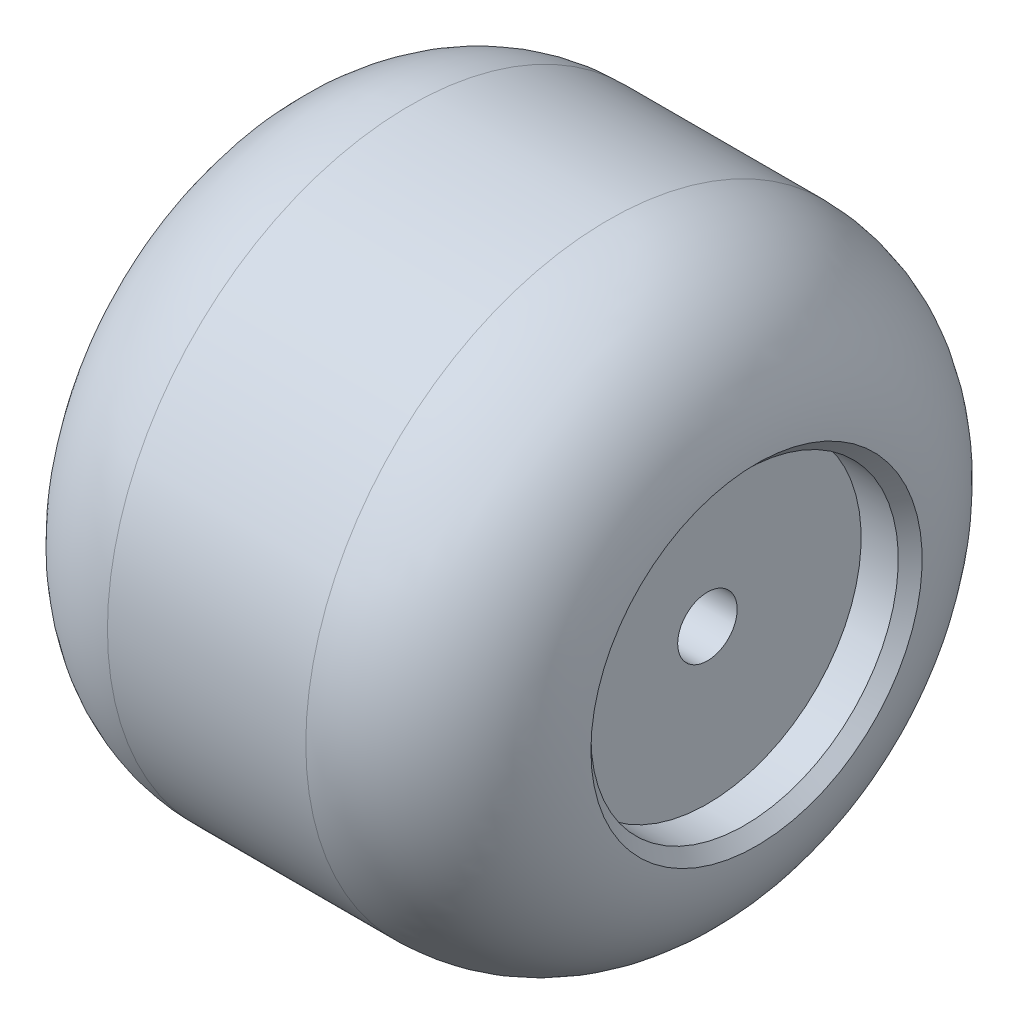
ISO-10303-21;
HEADER;
FILE_DESCRIPTION(('STEP AP214'),'2;1');
FILE_NAME('part.step','',(''),(''),'','','');
FILE_SCHEMA(('AUTOMOTIVE_DESIGN { 1 0 10303 214 1 1 1 1 }'));
ENDSEC;
DATA;
#1=APPLICATION_CONTEXT('core data for automotive mechanical design processes');
#2=APPLICATION_PROTOCOL_DEFINITION('international standard','automotive_design',2000,#1);
#3=PRODUCT_CONTEXT('',#1,'mechanical');
#4=PRODUCT('Part','Part','',(#3));
#5=PRODUCT_RELATED_PRODUCT_CATEGORY('part','',(#4));
#6=PRODUCT_DEFINITION_FORMATION('','',#4);
#7=PRODUCT_DEFINITION_CONTEXT('part definition',#1,'design');
#8=PRODUCT_DEFINITION('design','',#6,#7);
#9=PRODUCT_DEFINITION_SHAPE('','',#8);
#10=(LENGTH_UNIT() NAMED_UNIT(*) SI_UNIT(.MILLI.,.METRE.));
#11=(NAMED_UNIT(*) PLANE_ANGLE_UNIT() SI_UNIT($,.RADIAN.));
#12=(NAMED_UNIT(*) SI_UNIT($,.STERADIAN.) SOLID_ANGLE_UNIT());
#13=UNCERTAINTY_MEASURE_WITH_UNIT(LENGTH_MEASURE(1.E-05),#10,'distance_accuracy_value','');
#14=(GEOMETRIC_REPRESENTATION_CONTEXT(3) GLOBAL_UNCERTAINTY_ASSIGNED_CONTEXT((#13)) GLOBAL_UNIT_ASSIGNED_CONTEXT((#10,
#11,#12)) REPRESENTATION_CONTEXT('',''));
#15=CARTESIAN_POINT('',(0.,0.,0.));
#16=DIRECTION('',(0.,0.,1.));
#17=DIRECTION('',(1.,0.,0.));
#18=AXIS2_PLACEMENT_3D('',#15,#16,#17);
#19=CARTESIAN_POINT('',(6.,0.,0.));
#20=DIRECTION('',(-1.,0.,0.));
#21=DIRECTION('',(0.,0.,1.));
#22=AXIS2_PLACEMENT_3D('',#19,#20,#21);
#23=TOROIDAL_SURFACE('',#22,6.2,6.);
#24=CARTESIAN_POINT('',(6.,0.,0.));
#25=DIRECTION('',(-1.,0.,0.));
#26=DIRECTION('',(0.,0.,1.));
#27=AXIS2_PLACEMENT_3D('',#24,#25,#26);
#28=CIRCLE('',#27,12.2);
#29=CARTESIAN_POINT('',(6.,0.,12.2));
#30=VERTEX_POINT('',#29);
#31=EDGE_CURVE('E80',#30,#30,#28,.T.);
#32=ORIENTED_EDGE('',*,*,#31,.T.);
#33=EDGE_LOOP('',(#32));
#34=FACE_BOUND('',#33,.T.);
#35=CARTESIAN_POINT('',(0.,0.,0.));
#36=DIRECTION('',(-1.,0.,0.));
#37=DIRECTION('',(0.,0.,1.));
#38=AXIS2_PLACEMENT_3D('',#35,#36,#37);
#39=CIRCLE('',#38,6.2);
#40=CARTESIAN_POINT('',(0.,0.,6.2));
#41=VERTEX_POINT('',#40);
#42=EDGE_CURVE('E10',#41,#41,#39,.T.);
#43=ORIENTED_EDGE('',*,*,#42,.F.);
#44=EDGE_LOOP('',(#43));
#45=FACE_BOUND('',#44,.T.);
#46=ADVANCED_FACE('F45',(#34,#45),#23,.T.);
#47=CARTESIAN_POINT('',(0.,0.,0.));
#48=DIRECTION('',(-1.,0.,0.));
#49=DIRECTION('',(0.,0.,1.));
#50=AXIS2_PLACEMENT_3D('',#47,#48,#49);
#51=PLANE('',#50);
#52=ORIENTED_EDGE('',*,*,#42,.T.);
#53=EDGE_LOOP('',(#52));
#54=FACE_BOUND('',#53,.T.);
#55=CARTESIAN_POINT('',(0.,0.,0.));
#56=DIRECTION('',(-1.,0.,0.));
#57=DIRECTION('',(0.,0.,1.));
#58=AXIS2_PLACEMENT_3D('',#55,#56,#57);
#59=CIRCLE('',#58,1.2);
#60=CARTESIAN_POINT('',(0.,0.,1.2));
#61=VERTEX_POINT('',#60);
#62=EDGE_CURVE('E52',#61,#61,#59,.T.);
#63=ORIENTED_EDGE('',*,*,#62,.F.);
#64=EDGE_LOOP('',(#63));
#65=FACE_BOUND('',#64,.T.);
#66=ADVANCED_FACE('F99',(#54,#65),#51,.T.);
#67=CARTESIAN_POINT('',(0.,0.,0.));
#68=DIRECTION('',(-1.,0.,0.));
#69=DIRECTION('',(0.,0.,1.));
#70=AXIS2_PLACEMENT_3D('',#67,#68,#69);
#71=CYLINDRICAL_SURFACE('',#70,1.2);
#72=CARTESIAN_POINT('',(18.,0.,0.));
#73=DIRECTION('',(-1.,0.,0.));
#74=DIRECTION('',(0.,0.,1.));
#75=AXIS2_PLACEMENT_3D('',#72,#73,#74);
#76=CIRCLE('',#75,1.2);
#77=CARTESIAN_POINT('',(18.,0.,1.2));
#78=VERTEX_POINT('',#77);
#79=EDGE_CURVE('E57',#78,#78,#76,.T.);
#80=ORIENTED_EDGE('',*,*,#79,.F.);
#81=EDGE_LOOP('',(#80));
#82=FACE_BOUND('',#81,.T.);
#83=ORIENTED_EDGE('',*,*,#62,.T.);
#84=EDGE_LOOP('',(#83));
#85=FACE_BOUND('',#84,.T.);
#86=ADVANCED_FACE('F103',(#82,#85),#71,.F.);
#87=CARTESIAN_POINT('',(18.,0.,0.));
#88=DIRECTION('',(1.,0.,0.));
#89=DIRECTION('',(0.,0.,-1.));
#90=AXIS2_PLACEMENT_3D('',#87,#88,#89);
#91=PLANE('',#90);
#92=ORIENTED_EDGE('',*,*,#79,.T.);
#93=EDGE_LOOP('',(#92));
#94=FACE_BOUND('',#93,.T.);
#95=CARTESIAN_POINT('',(18.,0.,0.));
#96=DIRECTION('',(-1.,0.,0.));
#97=DIRECTION('',(0.,0.,1.));
#98=AXIS2_PLACEMENT_3D('',#95,#96,#97);
#99=CIRCLE('',#98,6.2);
#100=CARTESIAN_POINT('',(18.,0.,6.2));
#101=VERTEX_POINT('',#100);
#102=EDGE_CURVE('E62',#101,#101,#99,.T.);
#103=ORIENTED_EDGE('',*,*,#102,.F.);
#104=EDGE_LOOP('',(#103));
#105=FACE_BOUND('',#104,.T.);
#106=ADVANCED_FACE('F107',(#94,#105),#91,.T.);
#107=CARTESIAN_POINT('',(0.,0.,0.));
#108=DIRECTION('',(-1.,0.,0.));
#109=DIRECTION('',(0.,0.,1.));
#110=AXIS2_PLACEMENT_3D('',#107,#108,#109);
#111=CYLINDRICAL_SURFACE('',#110,6.2);
#112=ORIENTED_EDGE('',*,*,#102,.T.);
#113=EDGE_LOOP('',(#112));
#114=FACE_BOUND('',#113,.T.);
#115=CARTESIAN_POINT('',(19.5,0.,0.));
#116=DIRECTION('',(-1.,0.,0.));
#117=DIRECTION('',(0.,0.,1.));
#118=AXIS2_PLACEMENT_3D('',#115,#116,#117);
#119=CIRCLE('',#118,6.2);
#120=CARTESIAN_POINT('',(19.5,0.,6.2));
#121=VERTEX_POINT('',#120);
#122=EDGE_CURVE('E68',#121,#121,#119,.T.);
#123=ORIENTED_EDGE('',*,*,#122,.F.);
#124=EDGE_LOOP('',(#123));
#125=FACE_BOUND('',#124,.T.);
#126=ADVANCED_FACE('F114',(#114,#125),#111,.F.);
#127=CARTESIAN_POINT('',(19.98071199583,0.,0.));
#128=DIRECTION('',(1.,0.,0.));
#129=DIRECTION('',(0.,0.,-1.));
#130=AXIS2_PLACEMENT_3D('',#127,#128,#129);
#131=CONICAL_SURFACE('',#130,6.68071199583001,0.785398163397447);
#132=ORIENTED_EDGE('',*,*,#122,.T.);
#133=EDGE_LOOP('',(#132));
#134=FACE_BOUND('',#133,.T.);
#135=CARTESIAN_POINT('',(19.98071199583,0.,0.));
#136=DIRECTION('',(-1.,0.,0.));
#137=DIRECTION('',(0.,0.,1.));
#138=AXIS2_PLACEMENT_3D('',#135,#136,#137);
#139=CIRCLE('',#138,6.68071199583001);
#140=CARTESIAN_POINT('',(19.98071199583,0.,6.68071199583001));
#141=VERTEX_POINT('',#140);
#142=EDGE_CURVE('E72',#141,#141,#139,.T.);
#143=ORIENTED_EDGE('',*,*,#142,.F.);
#144=EDGE_LOOP('',(#143));
#145=FACE_BOUND('',#144,.T.);
#146=ADVANCED_FACE('F95',(#134,#145),#131,.F.);
#147=CARTESIAN_POINT('',(14.,0.,0.));
#148=DIRECTION('',(-1.,0.,0.));
#149=DIRECTION('',(0.,0.,1.));
#150=AXIS2_PLACEMENT_3D('',#147,#148,#149);
#151=TOROIDAL_SURFACE('',#150,6.2,6.);
#152=CARTESIAN_POINT('',(14.,0.,0.));
#153=DIRECTION('',(-1.,0.,0.));
#154=DIRECTION('',(0.,0.,1.));
#155=AXIS2_PLACEMENT_3D('',#152,#153,#154);
#156=CIRCLE('',#155,12.2);
#157=CARTESIAN_POINT('',(14.,0.,12.2));
#158=VERTEX_POINT('',#157);
#159=EDGE_CURVE('E76',#158,#158,#156,.T.);
#160=ORIENTED_EDGE('',*,*,#159,.F.);
#161=EDGE_LOOP('',(#160));
#162=FACE_BOUND('',#161,.T.);
#163=ORIENTED_EDGE('',*,*,#142,.T.);
#164=EDGE_LOOP('',(#163));
#165=FACE_BOUND('',#164,.T.);
#166=ADVANCED_FACE('F89',(#162,#165),#151,.T.);
#167=CARTESIAN_POINT('',(0.,0.,0.));
#168=DIRECTION('',(-1.,0.,0.));
#169=DIRECTION('',(0.,0.,1.));
#170=AXIS2_PLACEMENT_3D('',#167,#168,#169);
#171=CYLINDRICAL_SURFACE('',#170,12.2);
#172=ORIENTED_EDGE('',*,*,#159,.T.);
#173=EDGE_LOOP('',(#172));
#174=FACE_BOUND('',#173,.T.);
#175=ORIENTED_EDGE('',*,*,#31,.F.);
#176=EDGE_LOOP('',(#175));
#177=FACE_BOUND('',#176,.T.);
#178=ADVANCED_FACE('F87',(#174,#177),#171,.T.);
#179=CLOSED_SHELL('',(#46,#66,#86,#106,#126,#146,#166,#178));
#180=MANIFOLD_SOLID_BREP('B2',#179);
#181=ADVANCED_BREP_SHAPE_REPRESENTATION('',(#18,#180),#14);
#182=SHAPE_DEFINITION_REPRESENTATION(#9,#181);
ENDSEC;
END-ISO-10303-21;
